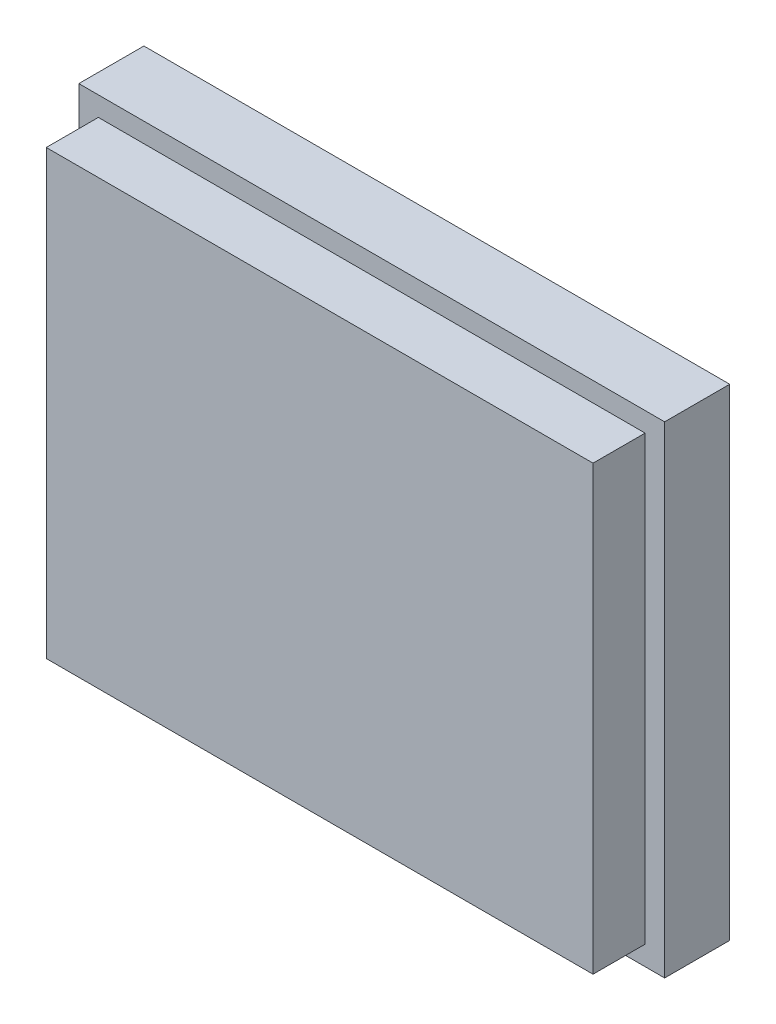
ISO-10303-21;
HEADER;
FILE_DESCRIPTION(('STEP AP214'),'2;1');
FILE_NAME('part.step','',(''),(''),'','','');
FILE_SCHEMA(('AUTOMOTIVE_DESIGN { 1 0 10303 214 1 1 1 1 }'));
ENDSEC;
DATA;
#1=APPLICATION_CONTEXT('core data for automotive mechanical design processes');
#2=APPLICATION_PROTOCOL_DEFINITION('international standard','automotive_design',2000,#1);
#3=PRODUCT_CONTEXT('',#1,'mechanical');
#4=PRODUCT('Part','Part','',(#3));
#5=PRODUCT_RELATED_PRODUCT_CATEGORY('part','',(#4));
#6=PRODUCT_DEFINITION_FORMATION('','',#4);
#7=PRODUCT_DEFINITION_CONTEXT('part definition',#1,'design');
#8=PRODUCT_DEFINITION('design','',#6,#7);
#9=PRODUCT_DEFINITION_SHAPE('','',#8);
#10=(LENGTH_UNIT() NAMED_UNIT(*) SI_UNIT(.MILLI.,.METRE.));
#11=(NAMED_UNIT(*) PLANE_ANGLE_UNIT() SI_UNIT($,.RADIAN.));
#12=(NAMED_UNIT(*) SI_UNIT($,.STERADIAN.) SOLID_ANGLE_UNIT());
#13=UNCERTAINTY_MEASURE_WITH_UNIT(LENGTH_MEASURE(1.E-05),#10,'distance_accuracy_value','');
#14=(GEOMETRIC_REPRESENTATION_CONTEXT(3) GLOBAL_UNCERTAINTY_ASSIGNED_CONTEXT((#13)) GLOBAL_UNIT_ASSIGNED_CONTEXT((#10,
#11,#12)) REPRESENTATION_CONTEXT('',''));
#15=CARTESIAN_POINT('',(0.,0.,0.));
#16=DIRECTION('',(0.,0.,1.));
#17=DIRECTION('',(1.,0.,0.));
#18=AXIS2_PLACEMENT_3D('',#15,#16,#17);
#19=CARTESIAN_POINT('',(0.,-34.,18.));
#20=DIRECTION('',(0.,1.,0.));
#21=DIRECTION('',(0.,0.,1.));
#22=AXIS2_PLACEMENT_3D('',#19,#20,#21);
#23=PLANE('',#22);
#24=DIRECTION('',(1.,0.,0.));
#25=VECTOR('',#24,1.);
#26=CARTESIAN_POINT('',(-42.,-34.,10.));
#27=LINE('',#26,#25);
#28=CARTESIAN_POINT('',(-42.,-34.,10.));
#29=VERTEX_POINT('',#28);
#30=CARTESIAN_POINT('',(42.,-34.,10.));
#31=VERTEX_POINT('',#30);
#32=EDGE_CURVE('E62',#29,#31,#27,.T.);
#33=ORIENTED_EDGE('',*,*,#32,.T.);
#34=DIRECTION('',(0.,0.,-1.));
#35=VECTOR('',#34,1.);
#36=CARTESIAN_POINT('',(42.,-34.,18.));
#37=LINE('',#36,#35);
#38=CARTESIAN_POINT('',(42.,-34.,18.));
#39=VERTEX_POINT('',#38);
#40=EDGE_CURVE('E11',#39,#31,#37,.T.);
#41=ORIENTED_EDGE('',*,*,#40,.F.);
#42=DIRECTION('',(1.,0.,0.));
#43=VECTOR('',#42,1.);
#44=CARTESIAN_POINT('',(0.,-34.,18.));
#45=LINE('',#44,#43);
#46=CARTESIAN_POINT('',(-42.,-34.,18.));
#47=VERTEX_POINT('',#46);
#48=EDGE_CURVE('E146',#47,#39,#45,.T.);
#49=ORIENTED_EDGE('',*,*,#48,.F.);
#50=DIRECTION('',(0.,0.,-1.));
#51=VECTOR('',#50,1.);
#52=CARTESIAN_POINT('',(-42.,-34.,18.));
#53=LINE('',#52,#51);
#54=EDGE_CURVE('E69',#47,#29,#53,.T.);
#55=ORIENTED_EDGE('',*,*,#54,.T.);
#56=EDGE_LOOP('',(#33,#41,#49,#55));
#57=FACE_BOUND('',#56,.T.);
#58=ADVANCED_FACE('F47',(#57),#23,.F.);
#59=CARTESIAN_POINT('',(42.,0.,18.));
#60=DIRECTION('',(-1.,0.,0.));
#61=DIRECTION('',(0.,0.,1.));
#62=AXIS2_PLACEMENT_3D('',#59,#60,#61);
#63=PLANE('',#62);
#64=DIRECTION('',(0.,1.,0.));
#65=VECTOR('',#64,1.);
#66=CARTESIAN_POINT('',(42.,-34.,10.));
#67=LINE('',#66,#65);
#68=CARTESIAN_POINT('',(42.,34.,10.));
#69=VERTEX_POINT('',#68);
#70=EDGE_CURVE('E114',#31,#69,#67,.T.);
#71=ORIENTED_EDGE('',*,*,#70,.T.);
#72=DIRECTION('',(0.,0.,-1.));
#73=VECTOR('',#72,1.);
#74=CARTESIAN_POINT('',(42.,34.,18.));
#75=LINE('',#74,#73);
#76=CARTESIAN_POINT('',(42.,34.,18.));
#77=VERTEX_POINT('',#76);
#78=EDGE_CURVE('E55',#77,#69,#75,.T.);
#79=ORIENTED_EDGE('',*,*,#78,.F.);
#80=DIRECTION('',(0.,1.,0.));
#81=VECTOR('',#80,1.);
#82=CARTESIAN_POINT('',(42.,0.,18.));
#83=LINE('',#82,#81);
#84=EDGE_CURVE('E143',#39,#77,#83,.T.);
#85=ORIENTED_EDGE('',*,*,#84,.F.);
#86=ORIENTED_EDGE('',*,*,#40,.T.);
#87=EDGE_LOOP('',(#71,#79,#85,#86));
#88=FACE_BOUND('',#87,.T.);
#89=ADVANCED_FACE('F123',(#88),#63,.F.);
#90=CARTESIAN_POINT('',(0.,34.,18.));
#91=DIRECTION('',(0.,1.,0.));
#92=DIRECTION('',(0.,0.,1.));
#93=AXIS2_PLACEMENT_3D('',#90,#91,#92);
#94=PLANE('',#93);
#95=ORIENTED_EDGE('',*,*,#78,.T.);
#96=DIRECTION('',(-1.,0.,0.));
#97=VECTOR('',#96,1.);
#98=CARTESIAN_POINT('',(-42.,34.,10.));
#99=LINE('',#98,#97);
#100=CARTESIAN_POINT('',(-42.,34.,10.));
#101=VERTEX_POINT('',#100);
#102=EDGE_CURVE('E111',#69,#101,#99,.T.);
#103=ORIENTED_EDGE('',*,*,#102,.T.);
#104=DIRECTION('',(0.,0.,-1.));
#105=VECTOR('',#104,1.);
#106=CARTESIAN_POINT('',(-42.,34.,18.));
#107=LINE('',#106,#105);
#108=CARTESIAN_POINT('',(-42.,34.,18.));
#109=VERTEX_POINT('',#108);
#110=EDGE_CURVE('E132',#109,#101,#107,.T.);
#111=ORIENTED_EDGE('',*,*,#110,.F.);
#112=DIRECTION('',(1.,0.,0.));
#113=VECTOR('',#112,1.);
#114=CARTESIAN_POINT('',(0.,34.,18.));
#115=LINE('',#114,#113);
#116=EDGE_CURVE('E130',#109,#77,#115,.T.);
#117=ORIENTED_EDGE('',*,*,#116,.T.);
#118=EDGE_LOOP('',(#95,#103,#111,#117));
#119=FACE_BOUND('',#118,.T.);
#120=ADVANCED_FACE('F128',(#119),#94,.T.);
#121=CARTESIAN_POINT('',(-42.,0.,18.));
#122=DIRECTION('',(-1.,0.,0.));
#123=DIRECTION('',(0.,0.,1.));
#124=AXIS2_PLACEMENT_3D('',#121,#122,#123);
#125=PLANE('',#124);
#126=ORIENTED_EDGE('',*,*,#110,.T.);
#127=DIRECTION('',(0.,-1.,0.));
#128=VECTOR('',#127,1.);
#129=CARTESIAN_POINT('',(-42.,-34.,10.));
#130=LINE('',#129,#128);
#131=EDGE_CURVE('E115',#101,#29,#130,.T.);
#132=ORIENTED_EDGE('',*,*,#131,.T.);
#133=ORIENTED_EDGE('',*,*,#54,.F.);
#134=DIRECTION('',(0.,1.,0.));
#135=VECTOR('',#134,1.);
#136=CARTESIAN_POINT('',(-42.,0.,18.));
#137=LINE('',#136,#135);
#138=EDGE_CURVE('E138',#47,#109,#137,.T.);
#139=ORIENTED_EDGE('',*,*,#138,.T.);
#140=EDGE_LOOP('',(#126,#132,#133,#139));
#141=FACE_BOUND('',#140,.T.);
#142=ADVANCED_FACE('F195',(#141),#125,.T.);
#143=CARTESIAN_POINT('',(0.,0.,18.));
#144=DIRECTION('',(0.,0.,1.));
#145=DIRECTION('',(1.,0.,0.));
#146=AXIS2_PLACEMENT_3D('',#143,#144,#145);
#147=PLANE('',#146);
#148=ORIENTED_EDGE('',*,*,#48,.T.);
#149=ORIENTED_EDGE('',*,*,#84,.T.);
#150=ORIENTED_EDGE('',*,*,#116,.F.);
#151=ORIENTED_EDGE('',*,*,#138,.F.);
#152=EDGE_LOOP('',(#148,#149,#150,#151));
#153=FACE_BOUND('',#152,.T.);
#154=ADVANCED_FACE('F199',(#153),#147,.T.);
#155=CARTESIAN_POINT('',(0.,0.,10.));
#156=DIRECTION('',(0.,0.,-1.));
#157=DIRECTION('',(-1.,0.,0.));
#158=AXIS2_PLACEMENT_3D('',#155,#156,#157);
#159=PLANE('',#158);
#160=DIRECTION('',(0.,1.,0.));
#161=VECTOR('',#160,1.);
#162=CARTESIAN_POINT('',(45.,-37.,10.));
#163=LINE('',#162,#161);
#164=CARTESIAN_POINT('',(45.,-37.,10.));
#165=VERTEX_POINT('',#164);
#166=CARTESIAN_POINT('',(45.,37.,10.));
#167=VERTEX_POINT('',#166);
#168=EDGE_CURVE('E170',#165,#167,#163,.T.);
#169=ORIENTED_EDGE('',*,*,#168,.T.);
#170=DIRECTION('',(-1.,0.,0.));
#171=VECTOR('',#170,1.);
#172=CARTESIAN_POINT('',(-45.,37.,10.));
#173=LINE('',#172,#171);
#174=CARTESIAN_POINT('',(-45.,37.,10.));
#175=VERTEX_POINT('',#174);
#176=EDGE_CURVE('E186',#167,#175,#173,.T.);
#177=ORIENTED_EDGE('',*,*,#176,.T.);
#178=DIRECTION('',(0.,-1.,0.));
#179=VECTOR('',#178,1.);
#180=CARTESIAN_POINT('',(-45.,-37.,10.));
#181=LINE('',#180,#179);
#182=CARTESIAN_POINT('',(-45.,-37.,10.));
#183=VERTEX_POINT('',#182);
#184=EDGE_CURVE('E183',#175,#183,#181,.T.);
#185=ORIENTED_EDGE('',*,*,#184,.T.);
#186=DIRECTION('',(1.,0.,0.));
#187=VECTOR('',#186,1.);
#188=CARTESIAN_POINT('',(-45.,-37.,10.));
#189=LINE('',#188,#187);
#190=EDGE_CURVE('E166',#183,#165,#189,.T.);
#191=ORIENTED_EDGE('',*,*,#190,.T.);
#192=EDGE_LOOP('',(#169,#177,#185,#191));
#193=FACE_BOUND('',#192,.T.);
#194=ORIENTED_EDGE('',*,*,#70,.F.);
#195=ORIENTED_EDGE('',*,*,#32,.F.);
#196=ORIENTED_EDGE('',*,*,#131,.F.);
#197=ORIENTED_EDGE('',*,*,#102,.F.);
#198=EDGE_LOOP('',(#194,#195,#196,#197));
#199=FACE_BOUND('',#198,.T.);
#200=ADVANCED_FACE('F113',(#193,#199),#159,.F.);
#201=CARTESIAN_POINT('',(45.,-37.,10.));
#202=DIRECTION('',(-1.,0.,0.));
#203=DIRECTION('',(0.,0.,1.));
#204=AXIS2_PLACEMENT_3D('',#201,#202,#203);
#205=PLANE('',#204);
#206=DIRECTION('',(0.,1.,0.));
#207=VECTOR('',#206,1.);
#208=CARTESIAN_POINT('',(45.,-37.,0.));
#209=LINE('',#208,#207);
#210=CARTESIAN_POINT('',(45.,-37.,0.));
#211=VERTEX_POINT('',#210);
#212=CARTESIAN_POINT('',(45.,37.,0.));
#213=VERTEX_POINT('',#212);
#214=EDGE_CURVE('E177',#211,#213,#209,.T.);
#215=ORIENTED_EDGE('',*,*,#214,.T.);
#216=DIRECTION('',(0.,0.,-1.));
#217=VECTOR('',#216,1.);
#218=CARTESIAN_POINT('',(45.,37.,10.));
#219=LINE('',#218,#217);
#220=EDGE_CURVE('E150',#167,#213,#219,.T.);
#221=ORIENTED_EDGE('',*,*,#220,.F.);
#222=ORIENTED_EDGE('',*,*,#168,.F.);
#223=DIRECTION('',(0.,0.,-1.));
#224=VECTOR('',#223,1.);
#225=CARTESIAN_POINT('',(45.,-37.,10.));
#226=LINE('',#225,#224);
#227=EDGE_CURVE('E162',#165,#211,#226,.T.);
#228=ORIENTED_EDGE('',*,*,#227,.T.);
#229=EDGE_LOOP('',(#215,#221,#222,#228));
#230=FACE_BOUND('',#229,.T.);
#231=ADVANCED_FACE('F206',(#230),#205,.F.);
#232=CARTESIAN_POINT('',(-45.,37.,10.));
#233=DIRECTION('',(0.,-1.,0.));
#234=DIRECTION('',(0.,0.,-1.));
#235=AXIS2_PLACEMENT_3D('',#232,#233,#234);
#236=PLANE('',#235);
#237=DIRECTION('',(-1.,0.,0.));
#238=VECTOR('',#237,1.);
#239=CARTESIAN_POINT('',(-45.,37.,0.));
#240=LINE('',#239,#238);
#241=CARTESIAN_POINT('',(-45.,37.,0.));
#242=VERTEX_POINT('',#241);
#243=EDGE_CURVE('E174',#213,#242,#240,.T.);
#244=ORIENTED_EDGE('',*,*,#243,.T.);
#245=DIRECTION('',(0.,0.,-1.));
#246=VECTOR('',#245,1.);
#247=CARTESIAN_POINT('',(-45.,37.,10.));
#248=LINE('',#247,#246);
#249=EDGE_CURVE('E154',#175,#242,#248,.T.);
#250=ORIENTED_EDGE('',*,*,#249,.F.);
#251=ORIENTED_EDGE('',*,*,#176,.F.);
#252=ORIENTED_EDGE('',*,*,#220,.T.);
#253=EDGE_LOOP('',(#244,#250,#251,#252));
#254=FACE_BOUND('',#253,.T.);
#255=ADVANCED_FACE('F243',(#254),#236,.F.);
#256=CARTESIAN_POINT('',(-45.,-37.,10.));
#257=DIRECTION('',(1.,0.,0.));
#258=DIRECTION('',(0.,0.,-1.));
#259=AXIS2_PLACEMENT_3D('',#256,#257,#258);
#260=PLANE('',#259);
#261=DIRECTION('',(0.,-1.,0.));
#262=VECTOR('',#261,1.);
#263=CARTESIAN_POINT('',(-45.,-37.,0.));
#264=LINE('',#263,#262);
#265=CARTESIAN_POINT('',(-45.,-37.,0.));
#266=VERTEX_POINT('',#265);
#267=EDGE_CURVE('E171',#242,#266,#264,.T.);
#268=ORIENTED_EDGE('',*,*,#267,.T.);
#269=DIRECTION('',(0.,0.,-1.));
#270=VECTOR('',#269,1.);
#271=CARTESIAN_POINT('',(-45.,-37.,10.));
#272=LINE('',#271,#270);
#273=EDGE_CURVE('E158',#183,#266,#272,.T.);
#274=ORIENTED_EDGE('',*,*,#273,.F.);
#275=ORIENTED_EDGE('',*,*,#184,.F.);
#276=ORIENTED_EDGE('',*,*,#249,.T.);
#277=EDGE_LOOP('',(#268,#274,#275,#276));
#278=FACE_BOUND('',#277,.T.);
#279=ADVANCED_FACE('F227',(#278),#260,.F.);
#280=CARTESIAN_POINT('',(-45.,-37.,10.));
#281=DIRECTION('',(0.,1.,0.));
#282=DIRECTION('',(0.,0.,1.));
#283=AXIS2_PLACEMENT_3D('',#280,#281,#282);
#284=PLANE('',#283);
#285=DIRECTION('',(1.,0.,0.));
#286=VECTOR('',#285,1.);
#287=CARTESIAN_POINT('',(-45.,-37.,0.));
#288=LINE('',#287,#286);
#289=EDGE_CURVE('E167',#266,#211,#288,.T.);
#290=ORIENTED_EDGE('',*,*,#289,.T.);
#291=ORIENTED_EDGE('',*,*,#227,.F.);
#292=ORIENTED_EDGE('',*,*,#190,.F.);
#293=ORIENTED_EDGE('',*,*,#273,.T.);
#294=EDGE_LOOP('',(#290,#291,#292,#293));
#295=FACE_BOUND('',#294,.T.);
#296=ADVANCED_FACE('F222',(#295),#284,.F.);
#297=CARTESIAN_POINT('',(0.,0.,0.));
#298=DIRECTION('',(0.,0.,1.));
#299=DIRECTION('',(1.,0.,0.));
#300=AXIS2_PLACEMENT_3D('',#297,#298,#299);
#301=PLANE('',#300);
#302=ORIENTED_EDGE('',*,*,#214,.F.);
#303=ORIENTED_EDGE('',*,*,#289,.F.);
#304=ORIENTED_EDGE('',*,*,#267,.F.);
#305=ORIENTED_EDGE('',*,*,#243,.F.);
#306=EDGE_LOOP('',(#302,#303,#304,#305));
#307=FACE_BOUND('',#306,.T.);
#308=ADVANCED_FACE('F220',(#307),#301,.F.);
#309=CLOSED_SHELL('',(#58,#89,#120,#142,#154,#200,#231,#255,#279,#296,#308));
#310=MANIFOLD_SOLID_BREP('B2',#309);
#311=ADVANCED_BREP_SHAPE_REPRESENTATION('',(#18,#310),#14);
#312=SHAPE_DEFINITION_REPRESENTATION(#9,#311);
ENDSEC;
END-ISO-10303-21;
